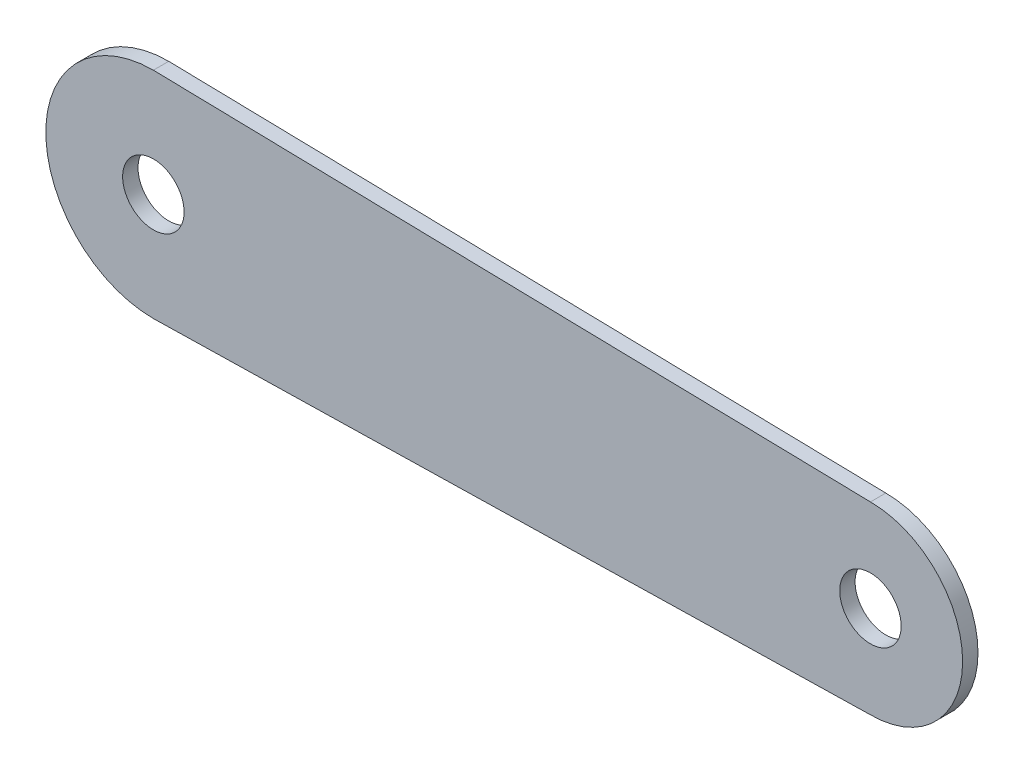
ISO-10303-21;
HEADER;
FILE_DESCRIPTION(('STEP AP214'),'2;1');
FILE_NAME('part.step','',(''),(''),'','','');
FILE_SCHEMA(('AUTOMOTIVE_DESIGN { 1 0 10303 214 1 1 1 1 }'));
ENDSEC;
DATA;
#1=APPLICATION_CONTEXT('core data for automotive mechanical design processes');
#2=APPLICATION_PROTOCOL_DEFINITION('international standard','automotive_design',2000,#1);
#3=PRODUCT_CONTEXT('',#1,'mechanical');
#4=PRODUCT('Part','Part','',(#3));
#5=PRODUCT_RELATED_PRODUCT_CATEGORY('part','',(#4));
#6=PRODUCT_DEFINITION_FORMATION('','',#4);
#7=PRODUCT_DEFINITION_CONTEXT('part definition',#1,'design');
#8=PRODUCT_DEFINITION('design','',#6,#7);
#9=PRODUCT_DEFINITION_SHAPE('','',#8);
#10=(LENGTH_UNIT() NAMED_UNIT(*) SI_UNIT(.MILLI.,.METRE.));
#11=(NAMED_UNIT(*) PLANE_ANGLE_UNIT() SI_UNIT($,.RADIAN.));
#12=(NAMED_UNIT(*) SI_UNIT($,.STERADIAN.) SOLID_ANGLE_UNIT());
#13=UNCERTAINTY_MEASURE_WITH_UNIT(LENGTH_MEASURE(1.E-05),#10,'distance_accuracy_value','');
#14=(GEOMETRIC_REPRESENTATION_CONTEXT(3) GLOBAL_UNCERTAINTY_ASSIGNED_CONTEXT((#13)) GLOBAL_UNIT_ASSIGNED_CONTEXT((#10,
#11,#12)) REPRESENTATION_CONTEXT('',''));
#15=CARTESIAN_POINT('',(0.,0.,0.));
#16=DIRECTION('',(0.,0.,1.));
#17=DIRECTION('',(1.,0.,0.));
#18=AXIS2_PLACEMENT_3D('',#15,#16,#17);
#19=CARTESIAN_POINT('',(-100.,0.,5.));
#20=DIRECTION('',(0.,0.,1.));
#21=DIRECTION('',(1.,0.,0.));
#22=AXIS2_PLACEMENT_3D('',#19,#20,#21);
#23=PLANE('',#22);
#24=CARTESIAN_POINT('',(-100.,0.,5.));
#25=DIRECTION('',(0.,0.,1.));
#26=DIRECTION('',(1.,0.,0.));
#27=AXIS2_PLACEMENT_3D('',#24,#25,#26);
#28=CIRCLE('',#27,9.99999999999999);
#29=CARTESIAN_POINT('',(-90.,0.,5.));
#30=VERTEX_POINT('',#29);
#31=EDGE_CURVE('E101',#30,#30,#28,.T.);
#32=ORIENTED_EDGE('',*,*,#31,.F.);
#33=EDGE_LOOP('',(#32));
#34=FACE_BOUND('',#33,.T.);
#35=CARTESIAN_POINT('',(-100.,0.,5.));
#36=DIRECTION('',(0.,0.,1.));
#37=DIRECTION('',(1.,0.,0.));
#38=AXIS2_PLACEMENT_3D('',#35,#36,#37);
#39=CIRCLE('',#38,35.);
#40=CARTESIAN_POINT('',(-100.,35.,5.));
#41=VERTEX_POINT('',#40);
#42=CARTESIAN_POINT('',(-100.,-35.,5.));
#43=VERTEX_POINT('',#42);
#44=EDGE_CURVE('E86',#41,#43,#39,.T.);
#45=ORIENTED_EDGE('',*,*,#44,.T.);
#46=DIRECTION('',(0.999770487201639,0.0214236532971702,0.));
#47=VECTOR('',#46,1.);
#48=CARTESIAN_POINT('',(133.333333333333,-30.0000000000018,5.));
#49=LINE('',#48,#47);
#50=CARTESIAN_POINT('',(133.333333333333,-30.0000000000015,5.));
#51=VERTEX_POINT('',#50);
#52=EDGE_CURVE('E81',#43,#51,#49,.T.);
#53=ORIENTED_EDGE('',*,*,#52,.T.);
#54=CARTESIAN_POINT('',(133.333333333333,0.,5.));
#55=DIRECTION('',(0.,0.,1.));
#56=DIRECTION('',(1.,0.,0.));
#57=AXIS2_PLACEMENT_3D('',#54,#55,#56);
#58=CIRCLE('',#57,30.0000000000015);
#59=CARTESIAN_POINT('',(133.333333333333,30.0000000000011,5.));
#60=VERTEX_POINT('',#59);
#61=EDGE_CURVE('E84',#51,#60,#58,.T.);
#62=ORIENTED_EDGE('',*,*,#61,.T.);
#63=DIRECTION('',(-0.999770487201639,0.0214236532971733,0.));
#64=VECTOR('',#63,1.);
#65=CARTESIAN_POINT('',(-100.,35.,5.));
#66=LINE('',#65,#64);
#67=EDGE_CURVE('E51',#60,#41,#66,.T.);
#68=ORIENTED_EDGE('',*,*,#67,.T.);
#69=EDGE_LOOP('',(#45,#53,#62,#68));
#70=FACE_BOUND('',#69,.T.);
#71=CARTESIAN_POINT('',(133.333333333333,0.,5.));
#72=DIRECTION('',(0.,0.,1.));
#73=DIRECTION('',(1.,0.,0.));
#74=AXIS2_PLACEMENT_3D('',#71,#72,#73);
#75=CIRCLE('',#74,10.);
#76=CARTESIAN_POINT('',(143.333333333333,0.,5.));
#77=VERTEX_POINT('',#76);
#78=EDGE_CURVE('E116',#77,#77,#75,.T.);
#79=ORIENTED_EDGE('',*,*,#78,.F.);
#80=EDGE_LOOP('',(#79));
#81=FACE_BOUND('',#80,.T.);
#82=ADVANCED_FACE('F34',(#34,#70,#81),#23,.T.);
#83=CARTESIAN_POINT('',(-100.,0.,0.));
#84=DIRECTION('',(0.,0.,1.));
#85=DIRECTION('',(1.,0.,0.));
#86=AXIS2_PLACEMENT_3D('',#83,#84,#85);
#87=PLANE('',#86);
#88=CARTESIAN_POINT('',(-100.,0.,0.));
#89=DIRECTION('',(0.,0.,1.));
#90=DIRECTION('',(1.,0.,0.));
#91=AXIS2_PLACEMENT_3D('',#88,#89,#90);
#92=CIRCLE('',#91,9.99999999999999);
#93=CARTESIAN_POINT('',(-90.,0.,0.));
#94=VERTEX_POINT('',#93);
#95=EDGE_CURVE('E113',#94,#94,#92,.T.);
#96=ORIENTED_EDGE('',*,*,#95,.T.);
#97=EDGE_LOOP('',(#96));
#98=FACE_BOUND('',#97,.T.);
#99=CARTESIAN_POINT('',(-100.,0.,0.));
#100=DIRECTION('',(0.,0.,1.));
#101=DIRECTION('',(1.,0.,0.));
#102=AXIS2_PLACEMENT_3D('',#99,#100,#101);
#103=CIRCLE('',#102,35.);
#104=CARTESIAN_POINT('',(-100.,35.,0.));
#105=VERTEX_POINT('',#104);
#106=CARTESIAN_POINT('',(-100.,-35.,0.));
#107=VERTEX_POINT('',#106);
#108=EDGE_CURVE('E98',#105,#107,#103,.T.);
#109=ORIENTED_EDGE('',*,*,#108,.F.);
#110=DIRECTION('',(-0.999770487201639,0.0214236532971733,0.));
#111=VECTOR('',#110,1.);
#112=CARTESIAN_POINT('',(-100.,35.,0.));
#113=LINE('',#112,#111);
#114=CARTESIAN_POINT('',(133.333333333333,30.0000000000011,0.));
#115=VERTEX_POINT('',#114);
#116=EDGE_CURVE('E74',#115,#105,#113,.T.);
#117=ORIENTED_EDGE('',*,*,#116,.F.);
#118=CARTESIAN_POINT('',(133.333333333333,0.,0.));
#119=DIRECTION('',(0.,0.,1.));
#120=DIRECTION('',(1.,0.,0.));
#121=AXIS2_PLACEMENT_3D('',#118,#119,#120);
#122=CIRCLE('',#121,30.0000000000015);
#123=CARTESIAN_POINT('',(133.333333333333,-30.0000000000015,0.));
#124=VERTEX_POINT('',#123);
#125=EDGE_CURVE('E68',#124,#115,#122,.T.);
#126=ORIENTED_EDGE('',*,*,#125,.F.);
#127=DIRECTION('',(0.999770487201639,0.0214236532971702,0.));
#128=VECTOR('',#127,1.);
#129=CARTESIAN_POINT('',(133.333333333333,-30.0000000000018,0.));
#130=LINE('',#129,#128);
#131=EDGE_CURVE('E90',#107,#124,#130,.T.);
#132=ORIENTED_EDGE('',*,*,#131,.F.);
#133=EDGE_LOOP('',(#109,#117,#126,#132));
#134=FACE_BOUND('',#133,.T.);
#135=CARTESIAN_POINT('',(133.333333333333,0.,0.));
#136=DIRECTION('',(0.,0.,1.));
#137=DIRECTION('',(1.,0.,0.));
#138=AXIS2_PLACEMENT_3D('',#135,#136,#137);
#139=CIRCLE('',#138,10.);
#140=CARTESIAN_POINT('',(143.333333333333,0.,0.));
#141=VERTEX_POINT('',#140);
#142=EDGE_CURVE('E119',#141,#141,#139,.T.);
#143=ORIENTED_EDGE('',*,*,#142,.T.);
#144=EDGE_LOOP('',(#143));
#145=FACE_BOUND('',#144,.T.);
#146=ADVANCED_FACE('F109',(#98,#134,#145),#87,.F.);
#147=CARTESIAN_POINT('',(-100.,0.,5.));
#148=DIRECTION('',(0.,0.,-1.));
#149=DIRECTION('',(-1.,0.,0.));
#150=AXIS2_PLACEMENT_3D('',#147,#148,#149);
#151=CYLINDRICAL_SURFACE('',#150,35.);
#152=ORIENTED_EDGE('',*,*,#108,.T.);
#153=DIRECTION('',(0.,0.,-1.));
#154=VECTOR('',#153,1.);
#155=CARTESIAN_POINT('',(-100.,-35.,5.));
#156=LINE('',#155,#154);
#157=EDGE_CURVE('E11',#43,#107,#156,.T.);
#158=ORIENTED_EDGE('',*,*,#157,.F.);
#159=ORIENTED_EDGE('',*,*,#44,.F.);
#160=DIRECTION('',(0.,0.,-1.));
#161=VECTOR('',#160,1.);
#162=CARTESIAN_POINT('',(-100.,35.,5.));
#163=LINE('',#162,#161);
#164=EDGE_CURVE('E94',#41,#105,#163,.T.);
#165=ORIENTED_EDGE('',*,*,#164,.T.);
#166=EDGE_LOOP('',(#152,#158,#159,#165));
#167=FACE_BOUND('',#166,.T.);
#168=ADVANCED_FACE('F36',(#167),#151,.T.);
#169=CARTESIAN_POINT('',(133.333333333333,-30.0000000000018,5.));
#170=DIRECTION('',(-0.0214236532971702,0.999770487201639,0.));
#171=DIRECTION('',(-0.999770487201639,-0.0214236532971702,0.));
#172=AXIS2_PLACEMENT_3D('',#169,#170,#171);
#173=PLANE('',#172);
#174=ORIENTED_EDGE('',*,*,#131,.T.);
#175=DIRECTION('',(0.,0.,-1.));
#176=VECTOR('',#175,1.);
#177=CARTESIAN_POINT('',(133.333333333333,-30.0000000000015,5.));
#178=LINE('',#177,#176);
#179=EDGE_CURVE('E43',#51,#124,#178,.T.);
#180=ORIENTED_EDGE('',*,*,#179,.F.);
#181=ORIENTED_EDGE('',*,*,#52,.F.);
#182=ORIENTED_EDGE('',*,*,#157,.T.);
#183=EDGE_LOOP('',(#174,#180,#181,#182));
#184=FACE_BOUND('',#183,.T.);
#185=ADVANCED_FACE('F89',(#184),#173,.F.);
#186=CARTESIAN_POINT('',(133.333333333333,0.,5.));
#187=DIRECTION('',(0.,0.,-1.));
#188=DIRECTION('',(-1.,0.,0.));
#189=AXIS2_PLACEMENT_3D('',#186,#187,#188);
#190=CYLINDRICAL_SURFACE('',#189,30.0000000000015);
#191=ORIENTED_EDGE('',*,*,#125,.T.);
#192=DIRECTION('',(0.,0.,-1.));
#193=VECTOR('',#192,1.);
#194=CARTESIAN_POINT('',(133.333333333333,30.0000000000011,5.));
#195=LINE('',#194,#193);
#196=EDGE_CURVE('E91',#60,#115,#195,.T.);
#197=ORIENTED_EDGE('',*,*,#196,.F.);
#198=ORIENTED_EDGE('',*,*,#61,.F.);
#199=ORIENTED_EDGE('',*,*,#179,.T.);
#200=EDGE_LOOP('',(#191,#197,#198,#199));
#201=FACE_BOUND('',#200,.T.);
#202=ADVANCED_FACE('F92',(#201),#190,.T.);
#203=CARTESIAN_POINT('',(-100.,35.,5.));
#204=DIRECTION('',(-0.0214236532971733,-0.999770487201639,0.));
#205=DIRECTION('',(0.999770487201639,-0.0214236532971733,0.));
#206=AXIS2_PLACEMENT_3D('',#203,#204,#205);
#207=PLANE('',#206);
#208=ORIENTED_EDGE('',*,*,#116,.T.);
#209=ORIENTED_EDGE('',*,*,#164,.F.);
#210=ORIENTED_EDGE('',*,*,#67,.F.);
#211=ORIENTED_EDGE('',*,*,#196,.T.);
#212=EDGE_LOOP('',(#208,#209,#210,#211));
#213=FACE_BOUND('',#212,.T.);
#214=ADVANCED_FACE('F106',(#213),#207,.F.);
#215=CARTESIAN_POINT('',(-100.,0.,5.));
#216=DIRECTION('',(0.,0.,-1.));
#217=DIRECTION('',(-1.,0.,0.));
#218=AXIS2_PLACEMENT_3D('',#215,#216,#217);
#219=CYLINDRICAL_SURFACE('',#218,9.99999999999999);
#220=ORIENTED_EDGE('',*,*,#31,.T.);
#221=EDGE_LOOP('',(#220));
#222=FACE_BOUND('',#221,.T.);
#223=ORIENTED_EDGE('',*,*,#95,.F.);
#224=EDGE_LOOP('',(#223));
#225=FACE_BOUND('',#224,.T.);
#226=ADVANCED_FACE('F137',(#222,#225),#219,.F.);
#227=CARTESIAN_POINT('',(133.333333333333,0.,5.));
#228=DIRECTION('',(0.,0.,-1.));
#229=DIRECTION('',(-1.,0.,0.));
#230=AXIS2_PLACEMENT_3D('',#227,#228,#229);
#231=CYLINDRICAL_SURFACE('',#230,10.);
#232=ORIENTED_EDGE('',*,*,#78,.T.);
#233=EDGE_LOOP('',(#232));
#234=FACE_BOUND('',#233,.T.);
#235=ORIENTED_EDGE('',*,*,#142,.F.);
#236=EDGE_LOOP('',(#235));
#237=FACE_BOUND('',#236,.T.);
#238=ADVANCED_FACE('F125',(#234,#237),#231,.F.);
#239=CLOSED_SHELL('',(#82,#146,#168,#185,#202,#214,#226,#238));
#240=MANIFOLD_SOLID_BREP('B2',#239);
#241=ADVANCED_BREP_SHAPE_REPRESENTATION('',(#18,#240),#14);
#242=SHAPE_DEFINITION_REPRESENTATION(#9,#241);
ENDSEC;
END-ISO-10303-21;
